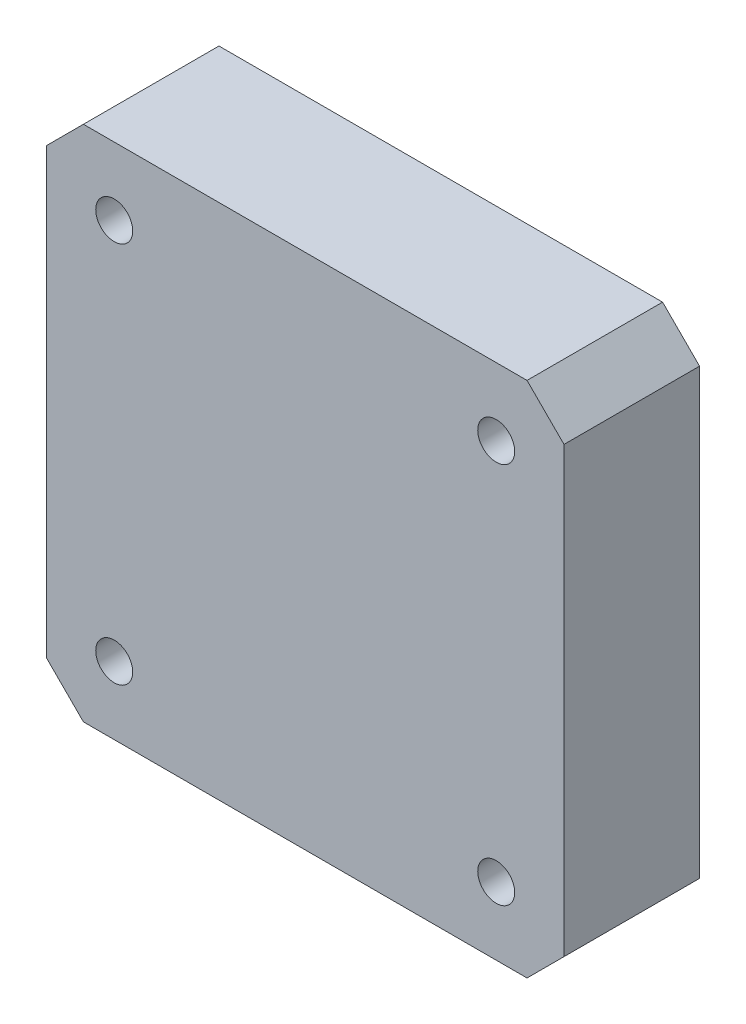
ISO-10303-21;
HEADER;
FILE_DESCRIPTION(('STEP AP214'),'2;1');
FILE_NAME('part.step','',(''),(''),'','','');
FILE_SCHEMA(('AUTOMOTIVE_DESIGN { 1 0 10303 214 1 1 1 1 }'));
ENDSEC;
DATA;
#1=APPLICATION_CONTEXT('core data for automotive mechanical design processes');
#2=APPLICATION_PROTOCOL_DEFINITION('international standard','automotive_design',2000,#1);
#3=PRODUCT_CONTEXT('',#1,'mechanical');
#4=PRODUCT('Part','Part','',(#3));
#5=PRODUCT_RELATED_PRODUCT_CATEGORY('part','',(#4));
#6=PRODUCT_DEFINITION_FORMATION('','',#4);
#7=PRODUCT_DEFINITION_CONTEXT('part definition',#1,'design');
#8=PRODUCT_DEFINITION('design','',#6,#7);
#9=PRODUCT_DEFINITION_SHAPE('','',#8);
#10=(LENGTH_UNIT() NAMED_UNIT(*) SI_UNIT(.MILLI.,.METRE.));
#11=(NAMED_UNIT(*) PLANE_ANGLE_UNIT() SI_UNIT($,.RADIAN.));
#12=(NAMED_UNIT(*) SI_UNIT($,.STERADIAN.) SOLID_ANGLE_UNIT());
#13=UNCERTAINTY_MEASURE_WITH_UNIT(LENGTH_MEASURE(1.E-05),#10,'distance_accuracy_value','');
#14=(GEOMETRIC_REPRESENTATION_CONTEXT(3) GLOBAL_UNCERTAINTY_ASSIGNED_CONTEXT((#13)) GLOBAL_UNIT_ASSIGNED_CONTEXT((#10,
#11,#12)) REPRESENTATION_CONTEXT('',''));
#15=CARTESIAN_POINT('',(0.,0.,0.));
#16=DIRECTION('',(0.,0.,1.));
#17=DIRECTION('',(1.,0.,0.));
#18=AXIS2_PLACEMENT_3D('',#15,#16,#17);
#19=CARTESIAN_POINT('',(-21.,21.,11.));
#20=DIRECTION('',(1.,0.,0.));
#21=DIRECTION('',(0.,1.,0.));
#22=AXIS2_PLACEMENT_3D('',#19,#20,#21);
#23=PLANE('',#22);
#24=DIRECTION('',(0.,-1.,0.));
#25=VECTOR('',#24,1.);
#26=CARTESIAN_POINT('',(-21.,21.,0.));
#27=LINE('',#26,#25);
#28=CARTESIAN_POINT('',(-21.,18.,0.));
#29=VERTEX_POINT('',#28);
#30=CARTESIAN_POINT('',(-21.,-18.,0.));
#31=VERTEX_POINT('',#30);
#32=EDGE_CURVE('E160',#29,#31,#27,.T.);
#33=ORIENTED_EDGE('',*,*,#32,.T.);
#34=DIRECTION('',(0.,0.,1.));
#35=VECTOR('',#34,1.);
#36=CARTESIAN_POINT('',(-21.,-18.,11.));
#37=LINE('',#36,#35);
#38=CARTESIAN_POINT('',(-21.,-18.,11.));
#39=VERTEX_POINT('',#38);
#40=EDGE_CURVE('E147',#31,#39,#37,.T.);
#41=ORIENTED_EDGE('',*,*,#40,.T.);
#42=DIRECTION('',(0.,-1.,0.));
#43=VECTOR('',#42,1.);
#44=CARTESIAN_POINT('',(-21.,21.,11.));
#45=LINE('',#44,#43);
#46=CARTESIAN_POINT('',(-21.,18.,11.));
#47=VERTEX_POINT('',#46);
#48=EDGE_CURVE('E162',#47,#39,#45,.T.);
#49=ORIENTED_EDGE('',*,*,#48,.F.);
#50=DIRECTION('',(0.,0.,-1.));
#51=VECTOR('',#50,1.);
#52=CARTESIAN_POINT('',(-21.,18.,0.));
#53=LINE('',#52,#51);
#54=EDGE_CURVE('E144',#47,#29,#53,.T.);
#55=ORIENTED_EDGE('',*,*,#54,.T.);
#56=EDGE_LOOP('',(#33,#41,#49,#55));
#57=FACE_BOUND('',#56,.T.);
#58=ADVANCED_FACE('F35',(#57),#23,.F.);
#59=CARTESIAN_POINT('',(-21.,-21.,11.));
#60=DIRECTION('',(0.,1.,0.));
#61=DIRECTION('',(0.,0.,1.));
#62=AXIS2_PLACEMENT_3D('',#59,#60,#61);
#63=PLANE('',#62);
#64=DIRECTION('',(1.,0.,0.));
#65=VECTOR('',#64,1.);
#66=CARTESIAN_POINT('',(-21.,-21.,0.));
#67=LINE('',#66,#65);
#68=CARTESIAN_POINT('',(-18.,-21.,0.));
#69=VERTEX_POINT('',#68);
#70=CARTESIAN_POINT('',(18.,-21.,0.));
#71=VERTEX_POINT('',#70);
#72=EDGE_CURVE('E118',#69,#71,#67,.T.);
#73=ORIENTED_EDGE('',*,*,#72,.T.);
#74=DIRECTION('',(0.,0.,1.));
#75=VECTOR('',#74,1.);
#76=CARTESIAN_POINT('',(18.,-21.,11.));
#77=LINE('',#76,#75);
#78=CARTESIAN_POINT('',(18.,-21.,11.));
#79=VERTEX_POINT('',#78);
#80=EDGE_CURVE('E135',#71,#79,#77,.T.);
#81=ORIENTED_EDGE('',*,*,#80,.T.);
#82=DIRECTION('',(1.,0.,0.));
#83=VECTOR('',#82,1.);
#84=CARTESIAN_POINT('',(-21.,-21.,11.));
#85=LINE('',#84,#83);
#86=CARTESIAN_POINT('',(-18.,-21.,11.));
#87=VERTEX_POINT('',#86);
#88=EDGE_CURVE('E173',#87,#79,#85,.T.);
#89=ORIENTED_EDGE('',*,*,#88,.F.);
#90=DIRECTION('',(0.,0.,-1.));
#91=VECTOR('',#90,1.);
#92=CARTESIAN_POINT('',(-18.,-21.,11.));
#93=LINE('',#92,#91);
#94=EDGE_CURVE('E132',#87,#69,#93,.T.);
#95=ORIENTED_EDGE('',*,*,#94,.T.);
#96=EDGE_LOOP('',(#73,#81,#89,#95));
#97=FACE_BOUND('',#96,.T.);
#98=ADVANCED_FACE('F224',(#97),#63,.F.);
#99=CARTESIAN_POINT('',(21.,21.,11.));
#100=DIRECTION('',(1.,0.,0.));
#101=DIRECTION('',(0.,1.,0.));
#102=AXIS2_PLACEMENT_3D('',#99,#100,#101);
#103=PLANE('',#102);
#104=DIRECTION('',(0.,-1.,0.));
#105=VECTOR('',#104,1.);
#106=CARTESIAN_POINT('',(21.,21.,11.));
#107=LINE('',#106,#105);
#108=CARTESIAN_POINT('',(21.,18.,11.));
#109=VERTEX_POINT('',#108);
#110=CARTESIAN_POINT('',(21.,-18.,11.));
#111=VERTEX_POINT('',#110);
#112=EDGE_CURVE('E123',#109,#111,#107,.T.);
#113=ORIENTED_EDGE('',*,*,#112,.T.);
#114=DIRECTION('',(0.,0.,-1.));
#115=VECTOR('',#114,1.);
#116=CARTESIAN_POINT('',(21.,-18.,0.));
#117=LINE('',#116,#115);
#118=CARTESIAN_POINT('',(21.,-18.,0.));
#119=VERTEX_POINT('',#118);
#120=EDGE_CURVE('E110',#111,#119,#117,.T.);
#121=ORIENTED_EDGE('',*,*,#120,.T.);
#122=DIRECTION('',(0.,-1.,0.));
#123=VECTOR('',#122,1.);
#124=CARTESIAN_POINT('',(21.,21.,0.));
#125=LINE('',#124,#123);
#126=CARTESIAN_POINT('',(21.,18.,0.));
#127=VERTEX_POINT('',#126);
#128=EDGE_CURVE('E103',#127,#119,#125,.T.);
#129=ORIENTED_EDGE('',*,*,#128,.F.);
#130=DIRECTION('',(0.,0.,1.));
#131=VECTOR('',#130,1.);
#132=CARTESIAN_POINT('',(21.,18.,11.));
#133=LINE('',#132,#131);
#134=EDGE_CURVE('E116',#127,#109,#133,.T.);
#135=ORIENTED_EDGE('',*,*,#134,.T.);
#136=EDGE_LOOP('',(#113,#121,#129,#135));
#137=FACE_BOUND('',#136,.T.);
#138=ADVANCED_FACE('F115',(#137),#103,.T.);
#139=CARTESIAN_POINT('',(-21.,21.,11.));
#140=DIRECTION('',(0.,1.,0.));
#141=DIRECTION('',(0.,0.,1.));
#142=AXIS2_PLACEMENT_3D('',#139,#140,#141);
#143=PLANE('',#142);
#144=DIRECTION('',(1.,0.,0.));
#145=VECTOR('',#144,1.);
#146=CARTESIAN_POINT('',(-21.,21.,0.));
#147=LINE('',#146,#145);
#148=CARTESIAN_POINT('',(-18.,21.,0.));
#149=VERTEX_POINT('',#148);
#150=CARTESIAN_POINT('',(18.,21.,0.));
#151=VERTEX_POINT('',#150);
#152=EDGE_CURVE('E104',#149,#151,#147,.T.);
#153=ORIENTED_EDGE('',*,*,#152,.F.);
#154=DIRECTION('',(0.,0.,1.));
#155=VECTOR('',#154,1.);
#156=CARTESIAN_POINT('',(-18.,21.,11.));
#157=LINE('',#156,#155);
#158=CARTESIAN_POINT('',(-18.,21.,11.));
#159=VERTEX_POINT('',#158);
#160=EDGE_CURVE('E11',#149,#159,#157,.T.);
#161=ORIENTED_EDGE('',*,*,#160,.T.);
#162=DIRECTION('',(1.,0.,0.));
#163=VECTOR('',#162,1.);
#164=CARTESIAN_POINT('',(-21.,21.,11.));
#165=LINE('',#164,#163);
#166=CARTESIAN_POINT('',(18.,21.,11.));
#167=VERTEX_POINT('',#166);
#168=EDGE_CURVE('E120',#159,#167,#165,.T.);
#169=ORIENTED_EDGE('',*,*,#168,.T.);
#170=DIRECTION('',(0.,0.,-1.));
#171=VECTOR('',#170,1.);
#172=CARTESIAN_POINT('',(18.,21.,11.));
#173=LINE('',#172,#171);
#174=EDGE_CURVE('E43',#167,#151,#173,.T.);
#175=ORIENTED_EDGE('',*,*,#174,.T.);
#176=EDGE_LOOP('',(#153,#161,#169,#175));
#177=FACE_BOUND('',#176,.T.);
#178=ADVANCED_FACE('F148',(#177),#143,.T.);
#179=CARTESIAN_POINT('',(0.,0.,11.));
#180=DIRECTION('',(0.,0.,1.));
#181=DIRECTION('',(1.,0.,0.));
#182=AXIS2_PLACEMENT_3D('',#179,#180,#181);
#183=PLANE('',#182);
#184=CARTESIAN_POINT('',(-15.5,-15.5,11.));
#185=DIRECTION('',(0.,0.,1.));
#186=DIRECTION('',(1.,0.,0.));
#187=AXIS2_PLACEMENT_3D('',#184,#185,#186);
#188=CIRCLE('',#187,1.5);
#189=CARTESIAN_POINT('',(-14.,-15.5,11.));
#190=VERTEX_POINT('',#189);
#191=EDGE_CURVE('E191',#190,#190,#188,.F.);
#192=ORIENTED_EDGE('',*,*,#191,.T.);
#193=EDGE_LOOP('',(#192));
#194=FACE_BOUND('',#193,.T.);
#195=CARTESIAN_POINT('',(15.5,-15.5,11.));
#196=DIRECTION('',(0.,0.,1.));
#197=DIRECTION('',(1.,0.,0.));
#198=AXIS2_PLACEMENT_3D('',#195,#196,#197);
#199=CIRCLE('',#198,1.5);
#200=CARTESIAN_POINT('',(17.,-15.5,11.));
#201=VERTEX_POINT('',#200);
#202=EDGE_CURVE('E185',#201,#201,#199,.F.);
#203=ORIENTED_EDGE('',*,*,#202,.T.);
#204=EDGE_LOOP('',(#203));
#205=FACE_BOUND('',#204,.T.);
#206=CARTESIAN_POINT('',(15.5,15.5,11.));
#207=DIRECTION('',(0.,0.,1.));
#208=DIRECTION('',(1.,0.,0.));
#209=AXIS2_PLACEMENT_3D('',#206,#207,#208);
#210=CIRCLE('',#209,1.5);
#211=CARTESIAN_POINT('',(17.,15.5,11.));
#212=VERTEX_POINT('',#211);
#213=EDGE_CURVE('E179',#212,#212,#210,.F.);
#214=ORIENTED_EDGE('',*,*,#213,.T.);
#215=EDGE_LOOP('',(#214));
#216=FACE_BOUND('',#215,.T.);
#217=CARTESIAN_POINT('',(-15.5,15.5,11.));
#218=DIRECTION('',(0.,0.,1.));
#219=DIRECTION('',(1.,0.,0.));
#220=AXIS2_PLACEMENT_3D('',#217,#218,#219);
#221=CIRCLE('',#220,1.5);
#222=CARTESIAN_POINT('',(-14.,15.5,11.));
#223=VERTEX_POINT('',#222);
#224=EDGE_CURVE('E169',#223,#223,#221,.F.);
#225=ORIENTED_EDGE('',*,*,#224,.T.);
#226=EDGE_LOOP('',(#225));
#227=FACE_BOUND('',#226,.T.);
#228=ORIENTED_EDGE('',*,*,#88,.T.);
#229=DIRECTION('',(0.707106781186548,0.707106781186547,0.));
#230=VECTOR('',#229,1.);
#231=CARTESIAN_POINT('',(19.5,-19.5,11.));
#232=LINE('',#231,#230);
#233=EDGE_CURVE('E142',#79,#111,#232,.T.);
#234=ORIENTED_EDGE('',*,*,#233,.T.);
#235=ORIENTED_EDGE('',*,*,#112,.F.);
#236=DIRECTION('',(0.707106781186546,-0.707106781186549,0.));
#237=VECTOR('',#236,1.);
#238=CARTESIAN_POINT('',(19.5,19.4999999999999,11.));
#239=LINE('',#238,#237);
#240=EDGE_CURVE('E50',#109,#167,#239,.F.);
#241=ORIENTED_EDGE('',*,*,#240,.T.);
#242=ORIENTED_EDGE('',*,*,#168,.F.);
#243=DIRECTION('',(-0.707106781186548,-0.707106781186547,0.));
#244=VECTOR('',#243,1.);
#245=CARTESIAN_POINT('',(-19.5,19.5,11.));
#246=LINE('',#245,#244);
#247=EDGE_CURVE('E138',#159,#47,#246,.T.);
#248=ORIENTED_EDGE('',*,*,#247,.T.);
#249=ORIENTED_EDGE('',*,*,#48,.T.);
#250=DIRECTION('',(-0.707106781186547,0.707106781186548,0.));
#251=VECTOR('',#250,1.);
#252=CARTESIAN_POINT('',(-19.5,-19.5,11.));
#253=LINE('',#252,#251);
#254=EDGE_CURVE('E140',#39,#87,#253,.F.);
#255=ORIENTED_EDGE('',*,*,#254,.T.);
#256=EDGE_LOOP('',(#228,#234,#235,#241,#242,#248,#249,#255));
#257=FACE_BOUND('',#256,.T.);
#258=ADVANCED_FACE('F151',(#194,#205,#216,#227,#257),#183,.T.);
#259=CARTESIAN_POINT('',(0.,0.,0.));
#260=DIRECTION('',(0.,0.,1.));
#261=DIRECTION('',(1.,0.,0.));
#262=AXIS2_PLACEMENT_3D('',#259,#260,#261);
#263=PLANE('',#262);
#264=CARTESIAN_POINT('',(-15.5,-15.5,0.));
#265=DIRECTION('',(0.,0.,-1.));
#266=DIRECTION('',(-1.,0.,0.));
#267=AXIS2_PLACEMENT_3D('',#264,#265,#266);
#268=CIRCLE('',#267,1.5);
#269=CARTESIAN_POINT('',(-17.,-15.5,0.));
#270=VERTEX_POINT('',#269);
#271=EDGE_CURVE('E188',#270,#270,#268,.T.);
#272=ORIENTED_EDGE('',*,*,#271,.F.);
#273=EDGE_LOOP('',(#272));
#274=FACE_BOUND('',#273,.T.);
#275=CARTESIAN_POINT('',(15.5,-15.5,0.));
#276=DIRECTION('',(0.,0.,-1.));
#277=DIRECTION('',(-1.,0.,0.));
#278=AXIS2_PLACEMENT_3D('',#275,#276,#277);
#279=CIRCLE('',#278,1.5);
#280=CARTESIAN_POINT('',(14.,-15.5,0.));
#281=VERTEX_POINT('',#280);
#282=EDGE_CURVE('E182',#281,#281,#279,.T.);
#283=ORIENTED_EDGE('',*,*,#282,.F.);
#284=EDGE_LOOP('',(#283));
#285=FACE_BOUND('',#284,.T.);
#286=CARTESIAN_POINT('',(15.5,15.5,0.));
#287=DIRECTION('',(0.,0.,-1.));
#288=DIRECTION('',(-1.,0.,0.));
#289=AXIS2_PLACEMENT_3D('',#286,#287,#288);
#290=CIRCLE('',#289,1.5);
#291=CARTESIAN_POINT('',(14.,15.5,0.));
#292=VERTEX_POINT('',#291);
#293=EDGE_CURVE('E177',#292,#292,#290,.T.);
#294=ORIENTED_EDGE('',*,*,#293,.F.);
#295=EDGE_LOOP('',(#294));
#296=FACE_BOUND('',#295,.T.);
#297=CARTESIAN_POINT('',(-15.5,15.5,0.));
#298=DIRECTION('',(0.,0.,-1.));
#299=DIRECTION('',(-1.,0.,0.));
#300=AXIS2_PLACEMENT_3D('',#297,#298,#299);
#301=CIRCLE('',#300,1.5);
#302=CARTESIAN_POINT('',(-17.,15.5,0.));
#303=VERTEX_POINT('',#302);
#304=EDGE_CURVE('E164',#303,#303,#301,.T.);
#305=ORIENTED_EDGE('',*,*,#304,.F.);
#306=EDGE_LOOP('',(#305));
#307=FACE_BOUND('',#306,.T.);
#308=ORIENTED_EDGE('',*,*,#128,.T.);
#309=DIRECTION('',(-0.707106781186548,-0.707106781186547,0.));
#310=VECTOR('',#309,1.);
#311=CARTESIAN_POINT('',(21.,-18.,0.));
#312=LINE('',#311,#310);
#313=EDGE_CURVE('E130',#119,#71,#312,.T.);
#314=ORIENTED_EDGE('',*,*,#313,.T.);
#315=ORIENTED_EDGE('',*,*,#72,.F.);
#316=DIRECTION('',(0.707106781186547,-0.707106781186548,0.));
#317=VECTOR('',#316,1.);
#318=CARTESIAN_POINT('',(-18.,-21.,0.));
#319=LINE('',#318,#317);
#320=EDGE_CURVE('E128',#69,#31,#319,.F.);
#321=ORIENTED_EDGE('',*,*,#320,.T.);
#322=ORIENTED_EDGE('',*,*,#32,.F.);
#323=DIRECTION('',(0.707106781186548,0.707106781186547,0.));
#324=VECTOR('',#323,1.);
#325=CARTESIAN_POINT('',(-21.,18.,0.));
#326=LINE('',#325,#324);
#327=EDGE_CURVE('E109',#29,#149,#326,.T.);
#328=ORIENTED_EDGE('',*,*,#327,.T.);
#329=ORIENTED_EDGE('',*,*,#152,.T.);
#330=DIRECTION('',(-0.707106781186546,0.707106781186549,0.));
#331=VECTOR('',#330,1.);
#332=CARTESIAN_POINT('',(18.,21.,0.));
#333=LINE('',#332,#331);
#334=EDGE_CURVE('E100',#151,#127,#333,.F.);
#335=ORIENTED_EDGE('',*,*,#334,.T.);
#336=EDGE_LOOP('',(#308,#314,#315,#321,#322,#328,#329,#335));
#337=FACE_BOUND('',#336,.T.);
#338=ADVANCED_FACE('F102',(#274,#285,#296,#307,#337),#263,.F.);
#339=CARTESIAN_POINT('',(21.,-18.,11.));
#340=DIRECTION('',(0.707106781186547,-0.707106781186548,0.));
#341=DIRECTION('',(0.,0.,1.));
#342=AXIS2_PLACEMENT_3D('',#339,#340,#341);
#343=PLANE('',#342);
#344=ORIENTED_EDGE('',*,*,#233,.F.);
#345=ORIENTED_EDGE('',*,*,#80,.F.);
#346=ORIENTED_EDGE('',*,*,#313,.F.);
#347=ORIENTED_EDGE('',*,*,#120,.F.);
#348=EDGE_LOOP('',(#344,#345,#346,#347));
#349=FACE_BOUND('',#348,.T.);
#350=ADVANCED_FACE('F201',(#349),#343,.T.);
#351=CARTESIAN_POINT('',(-18.,-21.,11.));
#352=DIRECTION('',(0.707106781186548,0.707106781186547,0.));
#353=DIRECTION('',(0.,0.,-1.));
#354=AXIS2_PLACEMENT_3D('',#351,#352,#353);
#355=PLANE('',#354);
#356=ORIENTED_EDGE('',*,*,#254,.F.);
#357=ORIENTED_EDGE('',*,*,#40,.F.);
#358=ORIENTED_EDGE('',*,*,#320,.F.);
#359=ORIENTED_EDGE('',*,*,#94,.F.);
#360=EDGE_LOOP('',(#356,#357,#358,#359));
#361=FACE_BOUND('',#360,.T.);
#362=ADVANCED_FACE('F235',(#361),#355,.F.);
#363=CARTESIAN_POINT('',(-21.,18.,11.));
#364=DIRECTION('',(-0.707106781186547,0.707106781186548,0.));
#365=DIRECTION('',(0.,0.,1.));
#366=AXIS2_PLACEMENT_3D('',#363,#364,#365);
#367=PLANE('',#366);
#368=ORIENTED_EDGE('',*,*,#247,.F.);
#369=ORIENTED_EDGE('',*,*,#160,.F.);
#370=ORIENTED_EDGE('',*,*,#327,.F.);
#371=ORIENTED_EDGE('',*,*,#54,.F.);
#372=EDGE_LOOP('',(#368,#369,#370,#371));
#373=FACE_BOUND('',#372,.T.);
#374=ADVANCED_FACE('F156',(#373),#367,.T.);
#375=CARTESIAN_POINT('',(18.,21.,11.));
#376=DIRECTION('',(-0.707106781186549,-0.707106781186546,0.));
#377=DIRECTION('',(0.,0.,-1.));
#378=AXIS2_PLACEMENT_3D('',#375,#376,#377);
#379=PLANE('',#378);
#380=ORIENTED_EDGE('',*,*,#240,.F.);
#381=ORIENTED_EDGE('',*,*,#134,.F.);
#382=ORIENTED_EDGE('',*,*,#334,.F.);
#383=ORIENTED_EDGE('',*,*,#174,.F.);
#384=EDGE_LOOP('',(#380,#381,#382,#383));
#385=FACE_BOUND('',#384,.T.);
#386=ADVANCED_FACE('F37',(#385),#379,.F.);
#387=CARTESIAN_POINT('',(-15.5,15.5,11.001));
#388=DIRECTION('',(0.,0.,-1.));
#389=DIRECTION('',(-1.,0.,0.));
#390=AXIS2_PLACEMENT_3D('',#387,#388,#389);
#391=CYLINDRICAL_SURFACE('',#390,1.5);
#392=ORIENTED_EDGE('',*,*,#224,.F.);
#393=EDGE_LOOP('',(#392));
#394=FACE_BOUND('',#393,.T.);
#395=ORIENTED_EDGE('',*,*,#304,.T.);
#396=EDGE_LOOP('',(#395));
#397=FACE_BOUND('',#396,.T.);
#398=ADVANCED_FACE('F209',(#394,#397),#391,.F.);
#399=CARTESIAN_POINT('',(15.5,15.5,11.001));
#400=DIRECTION('',(0.,0.,-1.));
#401=DIRECTION('',(-1.,0.,0.));
#402=AXIS2_PLACEMENT_3D('',#399,#400,#401);
#403=CYLINDRICAL_SURFACE('',#402,1.5);
#404=ORIENTED_EDGE('',*,*,#213,.F.);
#405=EDGE_LOOP('',(#404));
#406=FACE_BOUND('',#405,.T.);
#407=ORIENTED_EDGE('',*,*,#293,.T.);
#408=EDGE_LOOP('',(#407));
#409=FACE_BOUND('',#408,.T.);
#410=ADVANCED_FACE('F211',(#406,#409),#403,.F.);
#411=CARTESIAN_POINT('',(15.5,-15.5,11.001));
#412=DIRECTION('',(0.,0.,-1.));
#413=DIRECTION('',(-1.,0.,0.));
#414=AXIS2_PLACEMENT_3D('',#411,#412,#413);
#415=CYLINDRICAL_SURFACE('',#414,1.5);
#416=ORIENTED_EDGE('',*,*,#202,.F.);
#417=EDGE_LOOP('',(#416));
#418=FACE_BOUND('',#417,.T.);
#419=ORIENTED_EDGE('',*,*,#282,.T.);
#420=EDGE_LOOP('',(#419));
#421=FACE_BOUND('',#420,.T.);
#422=ADVANCED_FACE('F218',(#418,#421),#415,.F.);
#423=CARTESIAN_POINT('',(-15.5,-15.5,11.001));
#424=DIRECTION('',(0.,0.,-1.));
#425=DIRECTION('',(-1.,0.,0.));
#426=AXIS2_PLACEMENT_3D('',#423,#424,#425);
#427=CYLINDRICAL_SURFACE('',#426,1.5);
#428=ORIENTED_EDGE('',*,*,#191,.F.);
#429=EDGE_LOOP('',(#428));
#430=FACE_BOUND('',#429,.T.);
#431=ORIENTED_EDGE('',*,*,#271,.T.);
#432=EDGE_LOOP('',(#431));
#433=FACE_BOUND('',#432,.T.);
#434=ADVANCED_FACE('F197',(#430,#433),#427,.F.);
#435=CLOSED_SHELL('',(#58,#98,#138,#178,#258,#338,#350,#362,#374,#386,#398,#410,#422,#434));
#436=MANIFOLD_SOLID_BREP('B2',#435);
#437=ADVANCED_BREP_SHAPE_REPRESENTATION('',(#18,#436),#14);
#438=SHAPE_DEFINITION_REPRESENTATION(#9,#437);
ENDSEC;
END-ISO-10303-21;
